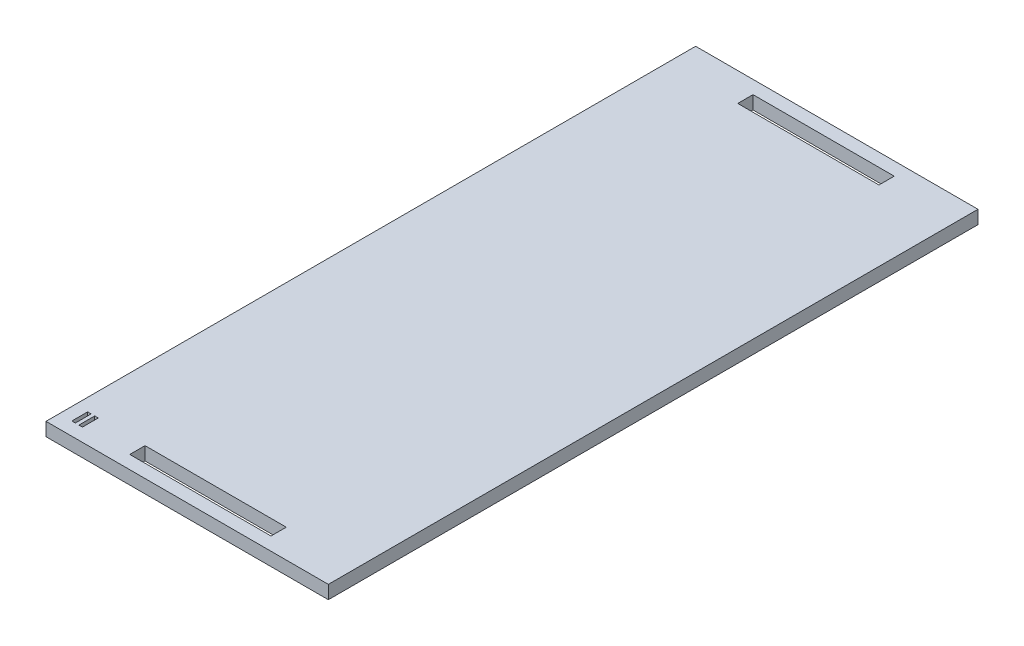
ISO-10303-21;
HEADER;
FILE_DESCRIPTION(('STEP AP214'),'2;1');
FILE_NAME('part.step','',(''),(''),'','','');
FILE_SCHEMA(('AUTOMOTIVE_DESIGN { 1 0 10303 214 1 1 1 1 }'));
ENDSEC;
DATA;
#1=APPLICATION_CONTEXT('core data for automotive mechanical design processes');
#2=APPLICATION_PROTOCOL_DEFINITION('international standard','automotive_design',2000,#1);
#3=PRODUCT_CONTEXT('',#1,'mechanical');
#4=PRODUCT('Part','Part','',(#3));
#5=PRODUCT_RELATED_PRODUCT_CATEGORY('part','',(#4));
#6=PRODUCT_DEFINITION_FORMATION('','',#4);
#7=PRODUCT_DEFINITION_CONTEXT('part definition',#1,'design');
#8=PRODUCT_DEFINITION('design','',#6,#7);
#9=PRODUCT_DEFINITION_SHAPE('','',#8);
#10=(LENGTH_UNIT() NAMED_UNIT(*) SI_UNIT(.MILLI.,.METRE.));
#11=(NAMED_UNIT(*) PLANE_ANGLE_UNIT() SI_UNIT($,.RADIAN.));
#12=(NAMED_UNIT(*) SI_UNIT($,.STERADIAN.) SOLID_ANGLE_UNIT());
#13=UNCERTAINTY_MEASURE_WITH_UNIT(LENGTH_MEASURE(1.E-05),#10,'distance_accuracy_value','');
#14=(GEOMETRIC_REPRESENTATION_CONTEXT(3) GLOBAL_UNCERTAINTY_ASSIGNED_CONTEXT((#13)) GLOBAL_UNIT_ASSIGNED_CONTEXT((#10,
#11,#12)) REPRESENTATION_CONTEXT('',''));
#15=CARTESIAN_POINT('',(0.,0.,0.));
#16=DIRECTION('',(0.,0.,1.));
#17=DIRECTION('',(1.,0.,0.));
#18=AXIS2_PLACEMENT_3D('',#15,#16,#17);
#19=CARTESIAN_POINT('',(0.,2.9972,66.4972));
#20=DIRECTION('',(0.,0.,-1.));
#21=DIRECTION('',(-1.,0.,0.));
#22=AXIS2_PLACEMENT_3D('',#19,#20,#21);
#23=PLANE('',#22);
#24=DIRECTION('',(1.,0.,0.));
#25=VECTOR('',#24,1.);
#26=CARTESIAN_POINT('',(0.,0.,66.4972));
#27=LINE('',#26,#25);
#28=CARTESIAN_POINT('',(-28.9002613565217,0.,66.4972));
#29=VERTEX_POINT('',#28);
#30=CARTESIAN_POINT('',(-28.1065113565217,0.,66.4972));
#31=VERTEX_POINT('',#30);
#32=EDGE_CURVE('E277',#29,#31,#27,.T.);
#33=ORIENTED_EDGE('',*,*,#32,.T.);
#34=DIRECTION('',(0.,-1.,0.));
#35=VECTOR('',#34,1.);
#36=CARTESIAN_POINT('',(-28.1065113565217,2.9972,66.4972));
#37=LINE('',#36,#35);
#38=CARTESIAN_POINT('',(-28.1065113565217,2.9972,66.4972));
#39=VERTEX_POINT('',#38);
#40=EDGE_CURVE('E11',#39,#31,#37,.T.);
#41=ORIENTED_EDGE('',*,*,#40,.F.);
#42=DIRECTION('',(1.,0.,0.));
#43=VECTOR('',#42,1.);
#44=CARTESIAN_POINT('',(0.,2.9972,66.4972));
#45=LINE('',#44,#43);
#46=CARTESIAN_POINT('',(-28.9002613565217,2.9972,66.4972));
#47=VERTEX_POINT('',#46);
#48=EDGE_CURVE('E193',#47,#39,#45,.T.);
#49=ORIENTED_EDGE('',*,*,#48,.F.);
#50=DIRECTION('',(0.,-1.,0.));
#51=VECTOR('',#50,1.);
#52=CARTESIAN_POINT('',(-28.9002613565217,2.9972,66.4972));
#53=LINE('',#52,#51);
#54=EDGE_CURVE('E61',#47,#29,#53,.T.);
#55=ORIENTED_EDGE('',*,*,#54,.T.);
#56=EDGE_LOOP('',(#33,#41,#49,#55));
#57=FACE_BOUND('',#56,.T.);
#58=ADVANCED_FACE('F41',(#57),#23,.F.);
#59=CARTESIAN_POINT('',(-28.1065113565217,2.9972,0.));
#60=DIRECTION('',(1.,0.,0.));
#61=DIRECTION('',(0.,0.,-1.));
#62=AXIS2_PLACEMENT_3D('',#59,#60,#61);
#63=PLANE('',#62);
#64=DIRECTION('',(0.,0.,1.));
#65=VECTOR('',#64,1.);
#66=CARTESIAN_POINT('',(-28.1065113565217,0.,0.));
#67=LINE('',#66,#65);
#68=CARTESIAN_POINT('',(-28.1065113565217,0.,70.0532));
#69=VERTEX_POINT('',#68);
#70=EDGE_CURVE('E200',#31,#69,#67,.T.);
#71=ORIENTED_EDGE('',*,*,#70,.T.);
#72=DIRECTION('',(0.,-1.,0.));
#73=VECTOR('',#72,1.);
#74=CARTESIAN_POINT('',(-28.1065113565217,2.9972,70.0532));
#75=LINE('',#74,#73);
#76=CARTESIAN_POINT('',(-28.1065113565217,2.9972,70.0532));
#77=VERTEX_POINT('',#76);
#78=EDGE_CURVE('E52',#77,#69,#75,.T.);
#79=ORIENTED_EDGE('',*,*,#78,.F.);
#80=DIRECTION('',(0.,0.,1.));
#81=VECTOR('',#80,1.);
#82=CARTESIAN_POINT('',(-28.1065113565217,2.9972,0.));
#83=LINE('',#82,#81);
#84=EDGE_CURVE('E187',#39,#77,#83,.T.);
#85=ORIENTED_EDGE('',*,*,#84,.F.);
#86=ORIENTED_EDGE('',*,*,#40,.T.);
#87=EDGE_LOOP('',(#71,#79,#85,#86));
#88=FACE_BOUND('',#87,.T.);
#89=ADVANCED_FACE('F199',(#88),#63,.F.);
#90=CARTESIAN_POINT('',(0.,2.9972,70.0532));
#91=DIRECTION('',(0.,0.,-1.));
#92=DIRECTION('',(-1.,0.,0.));
#93=AXIS2_PLACEMENT_3D('',#90,#91,#92);
#94=PLANE('',#93);
#95=DIRECTION('',(1.,0.,0.));
#96=VECTOR('',#95,1.);
#97=CARTESIAN_POINT('',(0.,0.,70.0532));
#98=LINE('',#97,#96);
#99=CARTESIAN_POINT('',(-28.9002613565217,0.,70.0532));
#100=VERTEX_POINT('',#99);
#101=EDGE_CURVE('E282',#100,#69,#98,.T.);
#102=ORIENTED_EDGE('',*,*,#101,.F.);
#103=DIRECTION('',(0.,-1.,0.));
#104=VECTOR('',#103,1.);
#105=CARTESIAN_POINT('',(-28.9002613565217,2.9972,70.0532));
#106=LINE('',#105,#104);
#107=CARTESIAN_POINT('',(-28.9002613565217,2.9972,70.0532));
#108=VERTEX_POINT('',#107);
#109=EDGE_CURVE('E123',#108,#100,#106,.T.);
#110=ORIENTED_EDGE('',*,*,#109,.F.);
#111=DIRECTION('',(1.,0.,0.));
#112=VECTOR('',#111,1.);
#113=CARTESIAN_POINT('',(0.,2.9972,70.0532));
#114=LINE('',#113,#112);
#115=EDGE_CURVE('E192',#108,#77,#114,.T.);
#116=ORIENTED_EDGE('',*,*,#115,.T.);
#117=ORIENTED_EDGE('',*,*,#78,.T.);
#118=EDGE_LOOP('',(#102,#110,#116,#117));
#119=FACE_BOUND('',#118,.T.);
#120=ADVANCED_FACE('F205',(#119),#94,.T.);
#121=CARTESIAN_POINT('',(0.,2.9972,66.6242));
#122=DIRECTION('',(0.,0.,-1.));
#123=DIRECTION('',(-1.,0.,0.));
#124=AXIS2_PLACEMENT_3D('',#121,#122,#123);
#125=PLANE('',#124);
#126=DIRECTION('',(1.,0.,0.));
#127=VECTOR('',#126,1.);
#128=CARTESIAN_POINT('',(0.,0.,66.6242));
#129=LINE('',#128,#127);
#130=CARTESIAN_POINT('',(-15.875,0.,66.6242));
#131=VERTEX_POINT('',#130);
#132=CARTESIAN_POINT('',(15.875,0.,66.6242));
#133=VERTEX_POINT('',#132);
#134=EDGE_CURVE('E261',#131,#133,#129,.T.);
#135=ORIENTED_EDGE('',*,*,#134,.T.);
#136=DIRECTION('',(0.,-1.,0.));
#137=VECTOR('',#136,1.);
#138=CARTESIAN_POINT('',(15.875,2.9972,66.6242));
#139=LINE('',#138,#137);
#140=CARTESIAN_POINT('',(15.875,2.9972,66.6242));
#141=VERTEX_POINT('',#140);
#142=EDGE_CURVE('E292',#141,#133,#139,.T.);
#143=ORIENTED_EDGE('',*,*,#142,.F.);
#144=DIRECTION('',(1.,0.,0.));
#145=VECTOR('',#144,1.);
#146=CARTESIAN_POINT('',(0.,2.9972,66.6242));
#147=LINE('',#146,#145);
#148=CARTESIAN_POINT('',(-15.875,2.9972,66.6242));
#149=VERTEX_POINT('',#148);
#150=EDGE_CURVE('E399',#149,#141,#147,.T.);
#151=ORIENTED_EDGE('',*,*,#150,.F.);
#152=DIRECTION('',(0.,-1.,0.));
#153=VECTOR('',#152,1.);
#154=CARTESIAN_POINT('',(-15.875,2.9972,66.6242));
#155=LINE('',#154,#153);
#156=EDGE_CURVE('E295',#149,#131,#155,.T.);
#157=ORIENTED_EDGE('',*,*,#156,.T.);
#158=EDGE_LOOP('',(#135,#143,#151,#157));
#159=FACE_BOUND('',#158,.T.);
#160=ADVANCED_FACE('F430',(#159),#125,.F.);
#161=CARTESIAN_POINT('',(15.8750000000001,2.9972,0.));
#162=DIRECTION('',(1.,0.,0.));
#163=DIRECTION('',(0.,0.,-1.));
#164=AXIS2_PLACEMENT_3D('',#161,#162,#163);
#165=PLANE('',#164);
#166=DIRECTION('',(0.,0.,1.));
#167=VECTOR('',#166,1.);
#168=CARTESIAN_POINT('',(15.8750000000001,0.,0.));
#169=LINE('',#168,#167);
#170=CARTESIAN_POINT('',(15.875,0.,70.0532));
#171=VERTEX_POINT('',#170);
#172=EDGE_CURVE('E265',#133,#171,#169,.T.);
#173=ORIENTED_EDGE('',*,*,#172,.T.);
#174=DIRECTION('',(0.,-1.,0.));
#175=VECTOR('',#174,1.);
#176=CARTESIAN_POINT('',(15.875,2.9972,70.0532));
#177=LINE('',#176,#175);
#178=CARTESIAN_POINT('',(15.875,2.9972,70.0532));
#179=VERTEX_POINT('',#178);
#180=EDGE_CURVE('E302',#179,#171,#177,.T.);
#181=ORIENTED_EDGE('',*,*,#180,.F.);
#182=DIRECTION('',(0.,0.,1.));
#183=VECTOR('',#182,1.);
#184=CARTESIAN_POINT('',(15.8750000000001,2.9972,0.));
#185=LINE('',#184,#183);
#186=EDGE_CURVE('E403',#141,#179,#185,.T.);
#187=ORIENTED_EDGE('',*,*,#186,.F.);
#188=ORIENTED_EDGE('',*,*,#142,.T.);
#189=EDGE_LOOP('',(#173,#181,#187,#188));
#190=FACE_BOUND('',#189,.T.);
#191=ADVANCED_FACE('F432',(#190),#165,.F.);
#192=CARTESIAN_POINT('',(0.,2.9972,70.0532));
#193=DIRECTION('',(0.,0.,-1.));
#194=DIRECTION('',(-1.,0.,0.));
#195=AXIS2_PLACEMENT_3D('',#192,#193,#194);
#196=PLANE('',#195);
#197=DIRECTION('',(1.,0.,0.));
#198=VECTOR('',#197,1.);
#199=CARTESIAN_POINT('',(0.,0.,70.0532));
#200=LINE('',#199,#198);
#201=CARTESIAN_POINT('',(-15.875,0.,70.0532));
#202=VERTEX_POINT('',#201);
#203=EDGE_CURVE('E269',#202,#171,#200,.T.);
#204=ORIENTED_EDGE('',*,*,#203,.F.);
#205=DIRECTION('',(0.,-1.,0.));
#206=VECTOR('',#205,1.);
#207=CARTESIAN_POINT('',(-15.875,2.9972,70.0532));
#208=LINE('',#207,#206);
#209=CARTESIAN_POINT('',(-15.875,2.9972,70.0532));
#210=VERTEX_POINT('',#209);
#211=EDGE_CURVE('E298',#210,#202,#208,.T.);
#212=ORIENTED_EDGE('',*,*,#211,.F.);
#213=DIRECTION('',(1.,0.,0.));
#214=VECTOR('',#213,1.);
#215=CARTESIAN_POINT('',(0.,2.9972,70.0532));
#216=LINE('',#215,#214);
#217=EDGE_CURVE('E406',#210,#179,#216,.T.);
#218=ORIENTED_EDGE('',*,*,#217,.T.);
#219=ORIENTED_EDGE('',*,*,#180,.T.);
#220=EDGE_LOOP('',(#204,#212,#218,#219));
#221=FACE_BOUND('',#220,.T.);
#222=ADVANCED_FACE('F425',(#221),#196,.T.);
#223=CARTESIAN_POINT('',(0.,2.9972,-70.0532));
#224=DIRECTION('',(0.,0.,-1.));
#225=DIRECTION('',(-1.,0.,0.));
#226=AXIS2_PLACEMENT_3D('',#223,#224,#225);
#227=PLANE('',#226);
#228=DIRECTION('',(1.,0.,0.));
#229=VECTOR('',#228,1.);
#230=CARTESIAN_POINT('',(0.,0.,-70.0532));
#231=LINE('',#230,#229);
#232=CARTESIAN_POINT('',(-15.875,0.,-70.0532));
#233=VERTEX_POINT('',#232);
#234=CARTESIAN_POINT('',(15.875,0.,-70.0532));
#235=VERTEX_POINT('',#234);
#236=EDGE_CURVE('E245',#233,#235,#231,.T.);
#237=ORIENTED_EDGE('',*,*,#236,.T.);
#238=DIRECTION('',(0.,-1.,0.));
#239=VECTOR('',#238,1.);
#240=CARTESIAN_POINT('',(15.875,2.9972,-70.0532));
#241=LINE('',#240,#239);
#242=CARTESIAN_POINT('',(15.875,2.9972,-70.0532));
#243=VERTEX_POINT('',#242);
#244=EDGE_CURVE('E299',#243,#235,#241,.T.);
#245=ORIENTED_EDGE('',*,*,#244,.F.);
#246=DIRECTION('',(1.,0.,0.));
#247=VECTOR('',#246,1.);
#248=CARTESIAN_POINT('',(0.,2.9972,-70.0532));
#249=LINE('',#248,#247);
#250=CARTESIAN_POINT('',(-15.875,2.9972,-70.0532));
#251=VERTEX_POINT('',#250);
#252=EDGE_CURVE('E384',#251,#243,#249,.T.);
#253=ORIENTED_EDGE('',*,*,#252,.F.);
#254=DIRECTION('',(0.,-1.,0.));
#255=VECTOR('',#254,1.);
#256=CARTESIAN_POINT('',(-15.875,2.9972,-70.0532));
#257=LINE('',#256,#255);
#258=EDGE_CURVE('E308',#251,#233,#257,.T.);
#259=ORIENTED_EDGE('',*,*,#258,.T.);
#260=EDGE_LOOP('',(#237,#245,#253,#259));
#261=FACE_BOUND('',#260,.T.);
#262=ADVANCED_FACE('F439',(#261),#227,.F.);
#263=CARTESIAN_POINT('',(15.875,2.9972,0.));
#264=DIRECTION('',(1.,0.,0.));
#265=DIRECTION('',(0.,0.,-1.));
#266=AXIS2_PLACEMENT_3D('',#263,#264,#265);
#267=PLANE('',#266);
#268=DIRECTION('',(0.,0.,1.));
#269=VECTOR('',#268,1.);
#270=CARTESIAN_POINT('',(15.875,0.,0.));
#271=LINE('',#270,#269);
#272=CARTESIAN_POINT('',(15.875,0.,-66.6242));
#273=VERTEX_POINT('',#272);
#274=EDGE_CURVE('E249',#235,#273,#271,.T.);
#275=ORIENTED_EDGE('',*,*,#274,.T.);
#276=DIRECTION('',(0.,-1.,0.));
#277=VECTOR('',#276,1.);
#278=CARTESIAN_POINT('',(15.875,2.9972,-66.6242));
#279=LINE('',#278,#277);
#280=CARTESIAN_POINT('',(15.875,2.9972,-66.6242));
#281=VERTEX_POINT('',#280);
#282=EDGE_CURVE('E315',#281,#273,#279,.T.);
#283=ORIENTED_EDGE('',*,*,#282,.F.);
#284=DIRECTION('',(0.,0.,1.));
#285=VECTOR('',#284,1.);
#286=CARTESIAN_POINT('',(15.875,2.9972,0.));
#287=LINE('',#286,#285);
#288=EDGE_CURVE('E388',#243,#281,#287,.T.);
#289=ORIENTED_EDGE('',*,*,#288,.F.);
#290=ORIENTED_EDGE('',*,*,#244,.T.);
#291=EDGE_LOOP('',(#275,#283,#289,#290));
#292=FACE_BOUND('',#291,.T.);
#293=ADVANCED_FACE('F485',(#292),#267,.F.);
#294=CARTESIAN_POINT('',(0.,2.9972,-66.6242));
#295=DIRECTION('',(0.,0.,-1.));
#296=DIRECTION('',(-1.,0.,0.));
#297=AXIS2_PLACEMENT_3D('',#294,#295,#296);
#298=PLANE('',#297);
#299=DIRECTION('',(1.,0.,0.));
#300=VECTOR('',#299,1.);
#301=CARTESIAN_POINT('',(0.,0.,-66.6242));
#302=LINE('',#301,#300);
#303=CARTESIAN_POINT('',(-15.875,0.,-66.6242));
#304=VERTEX_POINT('',#303);
#305=EDGE_CURVE('E253',#304,#273,#302,.T.);
#306=ORIENTED_EDGE('',*,*,#305,.F.);
#307=DIRECTION('',(0.,-1.,0.));
#308=VECTOR('',#307,1.);
#309=CARTESIAN_POINT('',(-15.875,2.9972,-66.6242));
#310=LINE('',#309,#308);
#311=CARTESIAN_POINT('',(-15.875,2.9972,-66.6242));
#312=VERTEX_POINT('',#311);
#313=EDGE_CURVE('E311',#312,#304,#310,.T.);
#314=ORIENTED_EDGE('',*,*,#313,.F.);
#315=DIRECTION('',(1.,0.,0.));
#316=VECTOR('',#315,1.);
#317=CARTESIAN_POINT('',(0.,2.9972,-66.6242));
#318=LINE('',#317,#316);
#319=EDGE_CURVE('E391',#312,#281,#318,.T.);
#320=ORIENTED_EDGE('',*,*,#319,.T.);
#321=ORIENTED_EDGE('',*,*,#282,.T.);
#322=EDGE_LOOP('',(#306,#314,#320,#321));
#323=FACE_BOUND('',#322,.T.);
#324=ADVANCED_FACE('F471',(#323),#298,.T.);
#325=CARTESIAN_POINT('',(-31.7372999999999,2.9972,0.));
#326=DIRECTION('',(-1.,0.,0.));
#327=DIRECTION('',(0.,0.,1.));
#328=AXIS2_PLACEMENT_3D('',#325,#326,#327);
#329=PLANE('',#328);
#330=DIRECTION('',(0.,0.,-1.));
#331=VECTOR('',#330,1.);
#332=CARTESIAN_POINT('',(-31.7372999999999,0.,0.));
#333=LINE('',#332,#331);
#334=CARTESIAN_POINT('',(-31.7372999999999,0.,73.025));
#335=VERTEX_POINT('',#334);
#336=CARTESIAN_POINT('',(-31.7372999999999,0.,-73.025));
#337=VERTEX_POINT('',#336);
#338=EDGE_CURVE('E229',#335,#337,#333,.T.);
#339=ORIENTED_EDGE('',*,*,#338,.F.);
#340=DIRECTION('',(0.,-1.,0.));
#341=VECTOR('',#340,1.);
#342=CARTESIAN_POINT('',(-31.7372999999999,2.9972,73.025));
#343=LINE('',#342,#341);
#344=CARTESIAN_POINT('',(-31.7372999999999,2.9972,73.025));
#345=VERTEX_POINT('',#344);
#346=EDGE_CURVE('E312',#345,#335,#343,.T.);
#347=ORIENTED_EDGE('',*,*,#346,.F.);
#348=DIRECTION('',(0.,0.,-1.));
#349=VECTOR('',#348,1.);
#350=CARTESIAN_POINT('',(-31.7372999999999,2.9972,0.));
#351=LINE('',#350,#349);
#352=CARTESIAN_POINT('',(-31.7372999999999,2.9972,-73.025));
#353=VERTEX_POINT('',#352);
#354=EDGE_CURVE('E363',#345,#353,#351,.T.);
#355=ORIENTED_EDGE('',*,*,#354,.T.);
#356=DIRECTION('',(0.,-1.,0.));
#357=VECTOR('',#356,1.);
#358=CARTESIAN_POINT('',(-31.7372999999999,2.9972,-73.025));
#359=LINE('',#358,#357);
#360=EDGE_CURVE('E321',#353,#337,#359,.T.);
#361=ORIENTED_EDGE('',*,*,#360,.T.);
#362=EDGE_LOOP('',(#339,#347,#355,#361));
#363=FACE_BOUND('',#362,.T.);
#364=ADVANCED_FACE('F467',(#363),#329,.T.);
#365=CARTESIAN_POINT('',(0.,2.9972,73.025));
#366=DIRECTION('',(0.,0.,1.));
#367=DIRECTION('',(1.,0.,0.));
#368=AXIS2_PLACEMENT_3D('',#365,#366,#367);
#369=PLANE('',#368);
#370=DIRECTION('',(-1.,0.,0.));
#371=VECTOR('',#370,1.);
#372=CARTESIAN_POINT('',(0.,0.,73.025));
#373=LINE('',#372,#371);
#374=CARTESIAN_POINT('',(31.7373000000001,0.,73.025));
#375=VERTEX_POINT('',#374);
#376=EDGE_CURVE('E233',#375,#335,#373,.T.);
#377=ORIENTED_EDGE('',*,*,#376,.F.);
#378=DIRECTION('',(0.,-1.,0.));
#379=VECTOR('',#378,1.);
#380=CARTESIAN_POINT('',(31.7373000000001,2.9972,73.025));
#381=LINE('',#380,#379);
#382=CARTESIAN_POINT('',(31.7373000000001,2.9972,73.025));
#383=VERTEX_POINT('',#382);
#384=EDGE_CURVE('E328',#383,#375,#381,.T.);
#385=ORIENTED_EDGE('',*,*,#384,.F.);
#386=DIRECTION('',(-1.,0.,0.));
#387=VECTOR('',#386,1.);
#388=CARTESIAN_POINT('',(0.,2.9972,73.025));
#389=LINE('',#388,#387);
#390=EDGE_CURVE('E369',#383,#345,#389,.T.);
#391=ORIENTED_EDGE('',*,*,#390,.T.);
#392=ORIENTED_EDGE('',*,*,#346,.T.);
#393=EDGE_LOOP('',(#377,#385,#391,#392));
#394=FACE_BOUND('',#393,.T.);
#395=ADVANCED_FACE('F470',(#394),#369,.T.);
#396=CARTESIAN_POINT('',(31.7373000000001,2.9972,0.));
#397=DIRECTION('',(-1.,0.,0.));
#398=DIRECTION('',(0.,0.,1.));
#399=AXIS2_PLACEMENT_3D('',#396,#397,#398);
#400=PLANE('',#399);
#401=DIRECTION('',(0.,0.,-1.));
#402=VECTOR('',#401,1.);
#403=CARTESIAN_POINT('',(31.7373000000001,0.,0.));
#404=LINE('',#403,#402);
#405=CARTESIAN_POINT('',(31.7373000000001,0.,-73.025));
#406=VERTEX_POINT('',#405);
#407=EDGE_CURVE('E237',#375,#406,#404,.T.);
#408=ORIENTED_EDGE('',*,*,#407,.T.);
#409=DIRECTION('',(0.,-1.,0.));
#410=VECTOR('',#409,1.);
#411=CARTESIAN_POINT('',(31.7373000000001,2.9972,-73.025));
#412=LINE('',#411,#410);
#413=CARTESIAN_POINT('',(31.7373000000001,2.9972,-73.025));
#414=VERTEX_POINT('',#413);
#415=EDGE_CURVE('E324',#414,#406,#412,.T.);
#416=ORIENTED_EDGE('',*,*,#415,.F.);
#417=DIRECTION('',(0.,0.,-1.));
#418=VECTOR('',#417,1.);
#419=CARTESIAN_POINT('',(31.7373000000001,2.9972,0.));
#420=LINE('',#419,#418);
#421=EDGE_CURVE('E377',#383,#414,#420,.T.);
#422=ORIENTED_EDGE('',*,*,#421,.F.);
#423=ORIENTED_EDGE('',*,*,#384,.T.);
#424=EDGE_LOOP('',(#408,#416,#422,#423));
#425=FACE_BOUND('',#424,.T.);
#426=ADVANCED_FACE('F475',(#425),#400,.F.);
#427=CARTESIAN_POINT('',(-26.5190113565217,2.9972,0.));
#428=DIRECTION('',(-1.,0.,0.));
#429=DIRECTION('',(0.,0.,1.));
#430=AXIS2_PLACEMENT_3D('',#427,#428,#429);
#431=PLANE('',#430);
#432=DIRECTION('',(0.,0.,-1.));
#433=VECTOR('',#432,1.);
#434=CARTESIAN_POINT('',(-26.5190113565217,0.,0.));
#435=LINE('',#434,#433);
#436=CARTESIAN_POINT('',(-26.5190113565217,0.,70.0532));
#437=VERTEX_POINT('',#436);
#438=CARTESIAN_POINT('',(-26.5190113565217,0.,66.4972));
#439=VERTEX_POINT('',#438);
#440=EDGE_CURVE('E214',#437,#439,#435,.T.);
#441=ORIENTED_EDGE('',*,*,#440,.F.);
#442=DIRECTION('',(0.,-1.,0.));
#443=VECTOR('',#442,1.);
#444=CARTESIAN_POINT('',(-26.5190113565217,2.9972,70.0532));
#445=LINE('',#444,#443);
#446=CARTESIAN_POINT('',(-26.5190113565217,2.9972,70.0532));
#447=VERTEX_POINT('',#446);
#448=EDGE_CURVE('E45',#447,#437,#445,.T.);
#449=ORIENTED_EDGE('',*,*,#448,.F.);
#450=DIRECTION('',(0.,0.,-1.));
#451=VECTOR('',#450,1.);
#452=CARTESIAN_POINT('',(-26.5190113565217,2.9972,0.));
#453=LINE('',#452,#451);
#454=CARTESIAN_POINT('',(-26.5190113565217,2.9972,66.4972));
#455=VERTEX_POINT('',#454);
#456=EDGE_CURVE('E289',#447,#455,#453,.T.);
#457=ORIENTED_EDGE('',*,*,#456,.T.);
#458=DIRECTION('',(0.,-1.,0.));
#459=VECTOR('',#458,1.);
#460=CARTESIAN_POINT('',(-26.5190113565217,2.9972,66.4972));
#461=LINE('',#460,#459);
#462=EDGE_CURVE('E210',#455,#439,#461,.T.);
#463=ORIENTED_EDGE('',*,*,#462,.T.);
#464=EDGE_LOOP('',(#441,#449,#457,#463));
#465=FACE_BOUND('',#464,.T.);
#466=ADVANCED_FACE('F43',(#465),#431,.T.);
#467=CARTESIAN_POINT('',(0.,2.9972,70.0532));
#468=DIRECTION('',(0.,0.,-1.));
#469=DIRECTION('',(-1.,0.,0.));
#470=AXIS2_PLACEMENT_3D('',#467,#468,#469);
#471=PLANE('',#470);
#472=DIRECTION('',(1.,0.,0.));
#473=VECTOR('',#472,1.);
#474=CARTESIAN_POINT('',(0.,0.,70.0532));
#475=LINE('',#474,#473);
#476=CARTESIAN_POINT('',(-27.3127613565217,0.,70.0532));
#477=VERTEX_POINT('',#476);
#478=EDGE_CURVE('E218',#477,#437,#475,.T.);
#479=ORIENTED_EDGE('',*,*,#478,.F.);
#480=DIRECTION('',(0.,-1.,0.));
#481=VECTOR('',#480,1.);
#482=CARTESIAN_POINT('',(-27.3127613565217,2.9972,70.0532));
#483=LINE('',#482,#481);
#484=CARTESIAN_POINT('',(-27.3127613565217,2.9972,70.0532));
#485=VERTEX_POINT('',#484);
#486=EDGE_CURVE('E338',#485,#477,#483,.T.);
#487=ORIENTED_EDGE('',*,*,#486,.F.);
#488=DIRECTION('',(1.,0.,0.));
#489=VECTOR('',#488,1.);
#490=CARTESIAN_POINT('',(0.,2.9972,70.0532));
#491=LINE('',#490,#489);
#492=EDGE_CURVE('E349',#485,#447,#491,.T.);
#493=ORIENTED_EDGE('',*,*,#492,.T.);
#494=ORIENTED_EDGE('',*,*,#448,.T.);
#495=EDGE_LOOP('',(#479,#487,#493,#494));
#496=FACE_BOUND('',#495,.T.);
#497=ADVANCED_FACE('F347',(#496),#471,.T.);
#498=CARTESIAN_POINT('',(-27.3127613565217,2.9972,0.));
#499=DIRECTION('',(-1.,0.,0.));
#500=DIRECTION('',(0.,0.,1.));
#501=AXIS2_PLACEMENT_3D('',#498,#499,#500);
#502=PLANE('',#501);
#503=DIRECTION('',(0.,0.,-1.));
#504=VECTOR('',#503,1.);
#505=CARTESIAN_POINT('',(-27.3127613565217,0.,0.));
#506=LINE('',#505,#504);
#507=CARTESIAN_POINT('',(-27.3127613565217,0.,66.4972));
#508=VERTEX_POINT('',#507);
#509=EDGE_CURVE('E222',#477,#508,#506,.T.);
#510=ORIENTED_EDGE('',*,*,#509,.T.);
#511=DIRECTION('',(0.,-1.,0.));
#512=VECTOR('',#511,1.);
#513=CARTESIAN_POINT('',(-27.3127613565217,2.9972,66.4972));
#514=LINE('',#513,#512);
#515=CARTESIAN_POINT('',(-27.3127613565217,2.9972,66.4972));
#516=VERTEX_POINT('',#515);
#517=EDGE_CURVE('E335',#516,#508,#514,.T.);
#518=ORIENTED_EDGE('',*,*,#517,.F.);
#519=DIRECTION('',(0.,0.,-1.));
#520=VECTOR('',#519,1.);
#521=CARTESIAN_POINT('',(-27.3127613565217,2.9972,0.));
#522=LINE('',#521,#520);
#523=EDGE_CURVE('E364',#485,#516,#522,.T.);
#524=ORIENTED_EDGE('',*,*,#523,.F.);
#525=ORIENTED_EDGE('',*,*,#486,.T.);
#526=EDGE_LOOP('',(#510,#518,#524,#525));
#527=FACE_BOUND('',#526,.T.);
#528=ADVANCED_FACE('F356',(#527),#502,.F.);
#529=CARTESIAN_POINT('',(-15.8750000000001,2.9972,0.));
#530=DIRECTION('',(1.,0.,0.));
#531=DIRECTION('',(0.,0.,-1.));
#532=AXIS2_PLACEMENT_3D('',#529,#530,#531);
#533=PLANE('',#532);
#534=DIRECTION('',(0.,0.,1.));
#535=VECTOR('',#534,1.);
#536=CARTESIAN_POINT('',(-15.8750000000001,0.,0.));
#537=LINE('',#536,#535);
#538=EDGE_CURVE('E273',#131,#202,#537,.T.);
#539=ORIENTED_EDGE('',*,*,#538,.F.);
#540=ORIENTED_EDGE('',*,*,#156,.F.);
#541=DIRECTION('',(0.,0.,1.));
#542=VECTOR('',#541,1.);
#543=CARTESIAN_POINT('',(-15.8750000000001,2.9972,0.));
#544=LINE('',#543,#542);
#545=EDGE_CURVE('E410',#149,#210,#544,.T.);
#546=ORIENTED_EDGE('',*,*,#545,.T.);
#547=ORIENTED_EDGE('',*,*,#211,.T.);
#548=EDGE_LOOP('',(#539,#540,#546,#547));
#549=FACE_BOUND('',#548,.T.);
#550=ADVANCED_FACE('F417',(#549),#533,.T.);
#551=CARTESIAN_POINT('',(-15.875,2.9972,0.));
#552=DIRECTION('',(1.,0.,0.));
#553=DIRECTION('',(0.,0.,-1.));
#554=AXIS2_PLACEMENT_3D('',#551,#552,#553);
#555=PLANE('',#554);
#556=DIRECTION('',(0.,0.,1.));
#557=VECTOR('',#556,1.);
#558=CARTESIAN_POINT('',(-15.875,0.,0.));
#559=LINE('',#558,#557);
#560=EDGE_CURVE('E257',#233,#304,#559,.T.);
#561=ORIENTED_EDGE('',*,*,#560,.F.);
#562=ORIENTED_EDGE('',*,*,#258,.F.);
#563=DIRECTION('',(0.,0.,1.));
#564=VECTOR('',#563,1.);
#565=CARTESIAN_POINT('',(-15.875,2.9972,0.));
#566=LINE('',#565,#564);
#567=EDGE_CURVE('E395',#251,#312,#566,.T.);
#568=ORIENTED_EDGE('',*,*,#567,.T.);
#569=ORIENTED_EDGE('',*,*,#313,.T.);
#570=EDGE_LOOP('',(#561,#562,#568,#569));
#571=FACE_BOUND('',#570,.T.);
#572=ADVANCED_FACE('F451',(#571),#555,.T.);
#573=CARTESIAN_POINT('',(0.,2.9972,-73.025));
#574=DIRECTION('',(0.,0.,1.));
#575=DIRECTION('',(1.,0.,0.));
#576=AXIS2_PLACEMENT_3D('',#573,#574,#575);
#577=PLANE('',#576);
#578=DIRECTION('',(-1.,0.,0.));
#579=VECTOR('',#578,1.);
#580=CARTESIAN_POINT('',(0.,0.,-73.025));
#581=LINE('',#580,#579);
#582=EDGE_CURVE('E241',#406,#337,#581,.T.);
#583=ORIENTED_EDGE('',*,*,#582,.T.);
#584=ORIENTED_EDGE('',*,*,#360,.F.);
#585=DIRECTION('',(-1.,0.,0.));
#586=VECTOR('',#585,1.);
#587=CARTESIAN_POINT('',(0.,2.9972,-73.025));
#588=LINE('',#587,#586);
#589=EDGE_CURVE('E381',#414,#353,#588,.T.);
#590=ORIENTED_EDGE('',*,*,#589,.F.);
#591=ORIENTED_EDGE('',*,*,#415,.T.);
#592=EDGE_LOOP('',(#583,#584,#590,#591));
#593=FACE_BOUND('',#592,.T.);
#594=ADVANCED_FACE('F456',(#593),#577,.F.);
#595=CARTESIAN_POINT('',(0.,2.9972,66.4972));
#596=DIRECTION('',(0.,0.,-1.));
#597=DIRECTION('',(-1.,0.,0.));
#598=AXIS2_PLACEMENT_3D('',#595,#596,#597);
#599=PLANE('',#598);
#600=DIRECTION('',(1.,0.,0.));
#601=VECTOR('',#600,1.);
#602=CARTESIAN_POINT('',(0.,0.,66.4972));
#603=LINE('',#602,#601);
#604=EDGE_CURVE('E225',#508,#439,#603,.T.);
#605=ORIENTED_EDGE('',*,*,#604,.T.);
#606=ORIENTED_EDGE('',*,*,#462,.F.);
#607=DIRECTION('',(1.,0.,0.));
#608=VECTOR('',#607,1.);
#609=CARTESIAN_POINT('',(0.,2.9972,66.4972));
#610=LINE('',#609,#608);
#611=EDGE_CURVE('E360',#516,#455,#610,.T.);
#612=ORIENTED_EDGE('',*,*,#611,.F.);
#613=ORIENTED_EDGE('',*,*,#517,.T.);
#614=EDGE_LOOP('',(#605,#606,#612,#613));
#615=FACE_BOUND('',#614,.T.);
#616=ADVANCED_FACE('F359',(#615),#599,.F.);
#617=CARTESIAN_POINT('',(-28.9002613565217,2.9972,0.));
#618=DIRECTION('',(1.,0.,0.));
#619=DIRECTION('',(0.,0.,-1.));
#620=AXIS2_PLACEMENT_3D('',#617,#618,#619);
#621=PLANE('',#620);
#622=DIRECTION('',(0.,0.,1.));
#623=VECTOR('',#622,1.);
#624=CARTESIAN_POINT('',(-28.9002613565217,0.,0.));
#625=LINE('',#624,#623);
#626=EDGE_CURVE('E285',#29,#100,#625,.T.);
#627=ORIENTED_EDGE('',*,*,#626,.F.);
#628=ORIENTED_EDGE('',*,*,#54,.F.);
#629=DIRECTION('',(0.,0.,1.));
#630=VECTOR('',#629,1.);
#631=CARTESIAN_POINT('',(-28.9002613565217,2.9972,0.));
#632=LINE('',#631,#630);
#633=EDGE_CURVE('E207',#47,#108,#632,.T.);
#634=ORIENTED_EDGE('',*,*,#633,.T.);
#635=ORIENTED_EDGE('',*,*,#109,.T.);
#636=EDGE_LOOP('',(#627,#628,#634,#635));
#637=FACE_BOUND('',#636,.T.);
#638=ADVANCED_FACE('F466',(#637),#621,.T.);
#639=CARTESIAN_POINT('',(0.,2.9972,0.));
#640=DIRECTION('',(0.,1.,0.));
#641=DIRECTION('',(0.,0.,1.));
#642=AXIS2_PLACEMENT_3D('',#639,#640,#641);
#643=PLANE('',#642);
#644=ORIENTED_EDGE('',*,*,#456,.F.);
#645=ORIENTED_EDGE('',*,*,#492,.F.);
#646=ORIENTED_EDGE('',*,*,#523,.T.);
#647=ORIENTED_EDGE('',*,*,#611,.T.);
#648=EDGE_LOOP('',(#644,#645,#646,#647));
#649=FACE_BOUND('',#648,.T.);
#650=ORIENTED_EDGE('',*,*,#354,.F.);
#651=ORIENTED_EDGE('',*,*,#390,.F.);
#652=ORIENTED_EDGE('',*,*,#421,.T.);
#653=ORIENTED_EDGE('',*,*,#589,.T.);
#654=EDGE_LOOP('',(#650,#651,#652,#653));
#655=FACE_BOUND('',#654,.T.);
#656=ORIENTED_EDGE('',*,*,#252,.T.);
#657=ORIENTED_EDGE('',*,*,#288,.T.);
#658=ORIENTED_EDGE('',*,*,#319,.F.);
#659=ORIENTED_EDGE('',*,*,#567,.F.);
#660=EDGE_LOOP('',(#656,#657,#658,#659));
#661=FACE_BOUND('',#660,.T.);
#662=ORIENTED_EDGE('',*,*,#150,.T.);
#663=ORIENTED_EDGE('',*,*,#186,.T.);
#664=ORIENTED_EDGE('',*,*,#217,.F.);
#665=ORIENTED_EDGE('',*,*,#545,.F.);
#666=EDGE_LOOP('',(#662,#663,#664,#665));
#667=FACE_BOUND('',#666,.T.);
#668=ORIENTED_EDGE('',*,*,#48,.T.);
#669=ORIENTED_EDGE('',*,*,#84,.T.);
#670=ORIENTED_EDGE('',*,*,#115,.F.);
#671=ORIENTED_EDGE('',*,*,#633,.F.);
#672=EDGE_LOOP('',(#668,#669,#670,#671));
#673=FACE_BOUND('',#672,.T.);
#674=ADVANCED_FACE('F189',(#649,#655,#661,#667,#673),#643,.T.);
#675=CARTESIAN_POINT('',(0.,0.,0.));
#676=DIRECTION('',(0.,1.,0.));
#677=DIRECTION('',(0.,0.,1.));
#678=AXIS2_PLACEMENT_3D('',#675,#676,#677);
#679=PLANE('',#678);
#680=ORIENTED_EDGE('',*,*,#440,.T.);
#681=ORIENTED_EDGE('',*,*,#604,.F.);
#682=ORIENTED_EDGE('',*,*,#509,.F.);
#683=ORIENTED_EDGE('',*,*,#478,.T.);
#684=EDGE_LOOP('',(#680,#681,#682,#683));
#685=FACE_BOUND('',#684,.T.);
#686=ORIENTED_EDGE('',*,*,#338,.T.);
#687=ORIENTED_EDGE('',*,*,#582,.F.);
#688=ORIENTED_EDGE('',*,*,#407,.F.);
#689=ORIENTED_EDGE('',*,*,#376,.T.);
#690=EDGE_LOOP('',(#686,#687,#688,#689));
#691=FACE_BOUND('',#690,.T.);
#692=ORIENTED_EDGE('',*,*,#236,.F.);
#693=ORIENTED_EDGE('',*,*,#560,.T.);
#694=ORIENTED_EDGE('',*,*,#305,.T.);
#695=ORIENTED_EDGE('',*,*,#274,.F.);
#696=EDGE_LOOP('',(#692,#693,#694,#695));
#697=FACE_BOUND('',#696,.T.);
#698=ORIENTED_EDGE('',*,*,#134,.F.);
#699=ORIENTED_EDGE('',*,*,#538,.T.);
#700=ORIENTED_EDGE('',*,*,#203,.T.);
#701=ORIENTED_EDGE('',*,*,#172,.F.);
#702=EDGE_LOOP('',(#698,#699,#700,#701));
#703=FACE_BOUND('',#702,.T.);
#704=ORIENTED_EDGE('',*,*,#32,.F.);
#705=ORIENTED_EDGE('',*,*,#626,.T.);
#706=ORIENTED_EDGE('',*,*,#101,.T.);
#707=ORIENTED_EDGE('',*,*,#70,.F.);
#708=EDGE_LOOP('',(#704,#705,#706,#707));
#709=FACE_BOUND('',#708,.T.);
#710=ADVANCED_FACE('F353',(#685,#691,#697,#703,#709),#679,.F.);
#711=CLOSED_SHELL('',(#58,#89,#120,#160,#191,#222,#262,#293,#324,#364,#395,#426,#466,#497,#528,
#550,#572,#594,#616,#638,#674,#710));
#712=MANIFOLD_SOLID_BREP('B2',#711);
#713=ADVANCED_BREP_SHAPE_REPRESENTATION('',(#18,#712),#14);
#714=SHAPE_DEFINITION_REPRESENTATION(#9,#713);
ENDSEC;
END-ISO-10303-21;
